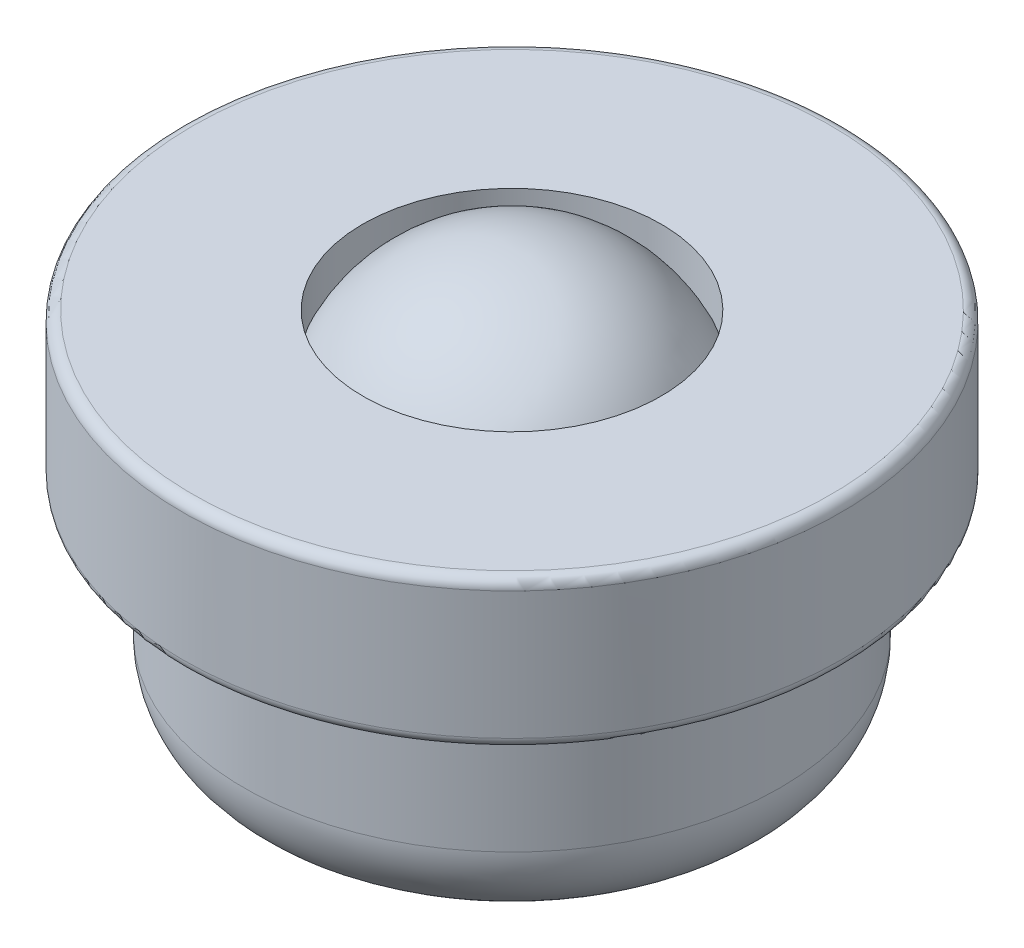
ISO-10303-21;
HEADER;
FILE_DESCRIPTION(('STEP AP214'),'2;1');
FILE_NAME('part.step','',(''),(''),'','','');
FILE_SCHEMA(('AUTOMOTIVE_DESIGN { 1 0 10303 214 1 1 1 1 }'));
ENDSEC;
DATA;
#1=APPLICATION_CONTEXT('core data for automotive mechanical design processes');
#2=APPLICATION_PROTOCOL_DEFINITION('international standard','automotive_design',2000,#1);
#3=PRODUCT_CONTEXT('',#1,'mechanical');
#4=PRODUCT('Part','Part','',(#3));
#5=PRODUCT_RELATED_PRODUCT_CATEGORY('part','',(#4));
#6=PRODUCT_DEFINITION_FORMATION('','',#4);
#7=PRODUCT_DEFINITION_CONTEXT('part definition',#1,'design');
#8=PRODUCT_DEFINITION('design','',#6,#7);
#9=PRODUCT_DEFINITION_SHAPE('','',#8);
#10=(LENGTH_UNIT() NAMED_UNIT(*) SI_UNIT(.MILLI.,.METRE.));
#11=(NAMED_UNIT(*) PLANE_ANGLE_UNIT() SI_UNIT($,.RADIAN.));
#12=(NAMED_UNIT(*) SI_UNIT($,.STERADIAN.) SOLID_ANGLE_UNIT());
#13=UNCERTAINTY_MEASURE_WITH_UNIT(LENGTH_MEASURE(1.E-05),#10,'distance_accuracy_value','');
#14=(GEOMETRIC_REPRESENTATION_CONTEXT(3) GLOBAL_UNCERTAINTY_ASSIGNED_CONTEXT((#13)) GLOBAL_UNIT_ASSIGNED_CONTEXT((#10,
#11,#12)) REPRESENTATION_CONTEXT('',''));
#15=CARTESIAN_POINT('',(0.,0.,0.));
#16=DIRECTION('',(0.,0.,1.));
#17=DIRECTION('',(1.,0.,0.));
#18=AXIS2_PLACEMENT_3D('',#15,#16,#17);
#19=CARTESIAN_POINT('',(0.,0.,0.));
#20=DIRECTION('',(0.,-1.,0.));
#21=DIRECTION('',(1.,0.,0.));
#22=AXIS2_PLACEMENT_3D('',#19,#20,#21);
#23=PLANE('',#22);
#24=CARTESIAN_POINT('',(0.,0.,0.));
#25=DIRECTION('',(0.,1.,0.));
#26=DIRECTION('',(-1.,0.,0.));
#27=AXIS2_PLACEMENT_3D('',#24,#25,#26);
#28=CIRCLE('',#27,4.5);
#29=CARTESIAN_POINT('',(-4.5,0.,0.));
#30=VERTEX_POINT('',#29);
#31=EDGE_CURVE('E52',#30,#30,#28,.T.);
#32=ORIENTED_EDGE('',*,*,#31,.F.);
#33=EDGE_LOOP('',(#32));
#34=FACE_BOUND('',#33,.T.);
#35=ADVANCED_FACE('F32',(#34),#23,.T.);
#36=CARTESIAN_POINT('',(0.,2.,0.));
#37=DIRECTION('',(0.,1.,0.));
#38=DIRECTION('',(-1.,0.,0.));
#39=AXIS2_PLACEMENT_3D('',#36,#37,#38);
#40=TOROIDAL_SURFACE('',#39,4.5,2.);
#41=ORIENTED_EDGE('',*,*,#31,.T.);
#42=EDGE_LOOP('',(#41));
#43=FACE_BOUND('',#42,.T.);
#44=CARTESIAN_POINT('',(0.,2.,0.));
#45=DIRECTION('',(0.,1.,0.));
#46=DIRECTION('',(-1.,0.,0.));
#47=AXIS2_PLACEMENT_3D('',#44,#45,#46);
#48=CIRCLE('',#47,6.5);
#49=CARTESIAN_POINT('',(-6.5,2.,0.));
#50=VERTEX_POINT('',#49);
#51=EDGE_CURVE('E55',#50,#50,#48,.T.);
#52=ORIENTED_EDGE('',*,*,#51,.F.);
#53=EDGE_LOOP('',(#52));
#54=FACE_BOUND('',#53,.T.);
#55=ADVANCED_FACE('F84',(#43,#54),#40,.T.);
#56=CARTESIAN_POINT('',(0.,10.1,0.));
#57=DIRECTION('',(0.,1.,0.));
#58=DIRECTION('',(-1.,0.,0.));
#59=AXIS2_PLACEMENT_3D('',#56,#57,#58);
#60=CYLINDRICAL_SURFACE('',#59,6.5);
#61=ORIENTED_EDGE('',*,*,#51,.T.);
#62=EDGE_LOOP('',(#61));
#63=FACE_BOUND('',#62,.T.);
#64=CARTESIAN_POINT('',(0.,5.2,0.));
#65=DIRECTION('',(0.,1.,0.));
#66=DIRECTION('',(-1.,0.,0.));
#67=AXIS2_PLACEMENT_3D('',#64,#65,#66);
#68=CIRCLE('',#67,6.5);
#69=CARTESIAN_POINT('',(-6.5,5.2,0.));
#70=VERTEX_POINT('',#69);
#71=EDGE_CURVE('E58',#70,#70,#68,.T.);
#72=ORIENTED_EDGE('',*,*,#71,.F.);
#73=EDGE_LOOP('',(#72));
#74=FACE_BOUND('',#73,.T.);
#75=ADVANCED_FACE('F90',(#63,#74),#60,.T.);
#76=CARTESIAN_POINT('',(-6.5,5.2,0.));
#77=DIRECTION('',(0.,-1.,0.));
#78=DIRECTION('',(1.,0.,0.));
#79=AXIS2_PLACEMENT_3D('',#76,#77,#78);
#80=PLANE('',#79);
#81=CARTESIAN_POINT('',(0.,5.2,0.));
#82=DIRECTION('',(0.,-1.,0.));
#83=DIRECTION('',(1.,0.,0.));
#84=AXIS2_PLACEMENT_3D('',#81,#82,#83);
#85=CIRCLE('',#84,7.75);
#86=CARTESIAN_POINT('',(7.75,5.2,0.));
#87=VERTEX_POINT('',#86);
#88=EDGE_CURVE('E39',#87,#87,#85,.T.);
#89=ORIENTED_EDGE('',*,*,#88,.T.);
#90=EDGE_LOOP('',(#89));
#91=FACE_BOUND('',#90,.T.);
#92=ORIENTED_EDGE('',*,*,#71,.T.);
#93=EDGE_LOOP('',(#92));
#94=FACE_BOUND('',#93,.T.);
#95=ADVANCED_FACE('F106',(#91,#94),#80,.T.);
#96=CARTESIAN_POINT('',(0.,10.1,0.));
#97=DIRECTION('',(0.,1.,0.));
#98=DIRECTION('',(-1.,0.,0.));
#99=AXIS2_PLACEMENT_3D('',#96,#97,#98);
#100=CYLINDRICAL_SURFACE('',#99,8.);
#101=CARTESIAN_POINT('',(0.,5.45,0.));
#102=DIRECTION('',(0.,-1.,0.));
#103=DIRECTION('',(1.,0.,0.));
#104=AXIS2_PLACEMENT_3D('',#101,#102,#103);
#105=CIRCLE('',#104,8.);
#106=CARTESIAN_POINT('',(8.,5.45,0.));
#107=VERTEX_POINT('',#106);
#108=EDGE_CURVE('E43',#107,#107,#105,.F.);
#109=ORIENTED_EDGE('',*,*,#108,.T.);
#110=EDGE_LOOP('',(#109));
#111=FACE_BOUND('',#110,.T.);
#112=CARTESIAN_POINT('',(0.,8.55,0.));
#113=DIRECTION('',(0.,1.,0.));
#114=DIRECTION('',(-1.,0.,0.));
#115=AXIS2_PLACEMENT_3D('',#112,#113,#114);
#116=CIRCLE('',#115,8.);
#117=CARTESIAN_POINT('',(-8.,8.55,0.));
#118=VERTEX_POINT('',#117);
#119=EDGE_CURVE('E47',#118,#118,#116,.F.);
#120=ORIENTED_EDGE('',*,*,#119,.T.);
#121=EDGE_LOOP('',(#120));
#122=FACE_BOUND('',#121,.T.);
#123=ADVANCED_FACE('F81',(#111,#122),#100,.T.);
#124=CARTESIAN_POINT('',(-8.,8.8,0.));
#125=DIRECTION('',(0.,1.,0.));
#126=DIRECTION('',(-1.,0.,0.));
#127=AXIS2_PLACEMENT_3D('',#124,#125,#126);
#128=PLANE('',#127);
#129=CARTESIAN_POINT('',(0.,8.8,0.));
#130=DIRECTION('',(0.,1.,0.));
#131=DIRECTION('',(-1.,0.,0.));
#132=AXIS2_PLACEMENT_3D('',#129,#130,#131);
#133=CIRCLE('',#132,7.75);
#134=CARTESIAN_POINT('',(-7.75,8.8,0.));
#135=VERTEX_POINT('',#134);
#136=EDGE_CURVE('E10',#135,#135,#133,.T.);
#137=ORIENTED_EDGE('',*,*,#136,.T.);
#138=EDGE_LOOP('',(#137));
#139=FACE_BOUND('',#138,.T.);
#140=CARTESIAN_POINT('',(0.,8.8,0.));
#141=DIRECTION('',(0.,1.,0.));
#142=DIRECTION('',(-1.,0.,0.));
#143=AXIS2_PLACEMENT_3D('',#140,#141,#142);
#144=CIRCLE('',#143,3.62077339804634);
#145=CARTESIAN_POINT('',(-3.62077339804634,8.8,0.));
#146=VERTEX_POINT('',#145);
#147=EDGE_CURVE('E61',#146,#146,#144,.T.);
#148=ORIENTED_EDGE('',*,*,#147,.F.);
#149=EDGE_LOOP('',(#148));
#150=FACE_BOUND('',#149,.T.);
#151=ADVANCED_FACE('F72',(#139,#150),#128,.T.);
#152=CARTESIAN_POINT('',(0.,10.1,0.));
#153=DIRECTION('',(0.,1.,0.));
#154=DIRECTION('',(-1.,0.,0.));
#155=AXIS2_PLACEMENT_3D('',#152,#153,#154);
#156=CYLINDRICAL_SURFACE('',#155,3.62077339804634);
#157=ORIENTED_EDGE('',*,*,#147,.T.);
#158=EDGE_LOOP('',(#157));
#159=FACE_BOUND('',#158,.T.);
#160=CARTESIAN_POINT('',(0.,7.8,0.));
#161=DIRECTION('',(0.,1.,0.));
#162=DIRECTION('',(-1.,0.,0.));
#163=AXIS2_PLACEMENT_3D('',#160,#161,#162);
#164=CIRCLE('',#163,3.62077339804634);
#165=CARTESIAN_POINT('',(-3.62077339804634,7.8,0.));
#166=VERTEX_POINT('',#165);
#167=EDGE_CURVE('E64',#166,#166,#164,.T.);
#168=ORIENTED_EDGE('',*,*,#167,.F.);
#169=EDGE_LOOP('',(#168));
#170=FACE_BOUND('',#169,.T.);
#171=ADVANCED_FACE('F70',(#159,#170),#156,.F.);
#172=CARTESIAN_POINT('',(0.,6.1,0.));
#173=DIRECTION('',(0.,1.,0.));
#174=DIRECTION('',(-1.,0.,0.));
#175=AXIS2_PLACEMENT_3D('',#172,#173,#174);
#176=SPHERICAL_SURFACE('',#175,4.);
#177=ORIENTED_EDGE('',*,*,#167,.T.);
#178=EDGE_LOOP('',(#177));
#179=FACE_BOUND('',#178,.T.);
#180=ADVANCED_FACE('F68',(#179),#176,.T.);
#181=CARTESIAN_POINT('',(0.,5.45,0.));
#182=DIRECTION('',(0.,-1.,0.));
#183=DIRECTION('',(1.,0.,0.));
#184=AXIS2_PLACEMENT_3D('',#181,#182,#183);
#185=TOROIDAL_SURFACE('',#184,7.75,0.25);
#186=ORIENTED_EDGE('',*,*,#88,.F.);
#187=EDGE_LOOP('',(#186));
#188=FACE_BOUND('',#187,.T.);
#189=ORIENTED_EDGE('',*,*,#108,.F.);
#190=EDGE_LOOP('',(#189));
#191=FACE_BOUND('',#190,.T.);
#192=ADVANCED_FACE('F79',(#188,#191),#185,.T.);
#193=CARTESIAN_POINT('',(0.,8.55,0.));
#194=DIRECTION('',(0.,1.,0.));
#195=DIRECTION('',(-1.,0.,0.));
#196=AXIS2_PLACEMENT_3D('',#193,#194,#195);
#197=TOROIDAL_SURFACE('',#196,7.75,0.25);
#198=ORIENTED_EDGE('',*,*,#119,.F.);
#199=EDGE_LOOP('',(#198));
#200=FACE_BOUND('',#199,.T.);
#201=ORIENTED_EDGE('',*,*,#136,.F.);
#202=EDGE_LOOP('',(#201));
#203=FACE_BOUND('',#202,.T.);
#204=ADVANCED_FACE('F34',(#200,#203),#197,.T.);
#205=CLOSED_SHELL('',(#35,#55,#75,#95,#123,#151,#171,#180,#192,#204));
#206=MANIFOLD_SOLID_BREP('B2',#205);
#207=ADVANCED_BREP_SHAPE_REPRESENTATION('',(#18,#206),#14);
#208=SHAPE_DEFINITION_REPRESENTATION(#9,#207);
ENDSEC;
END-ISO-10303-21;
